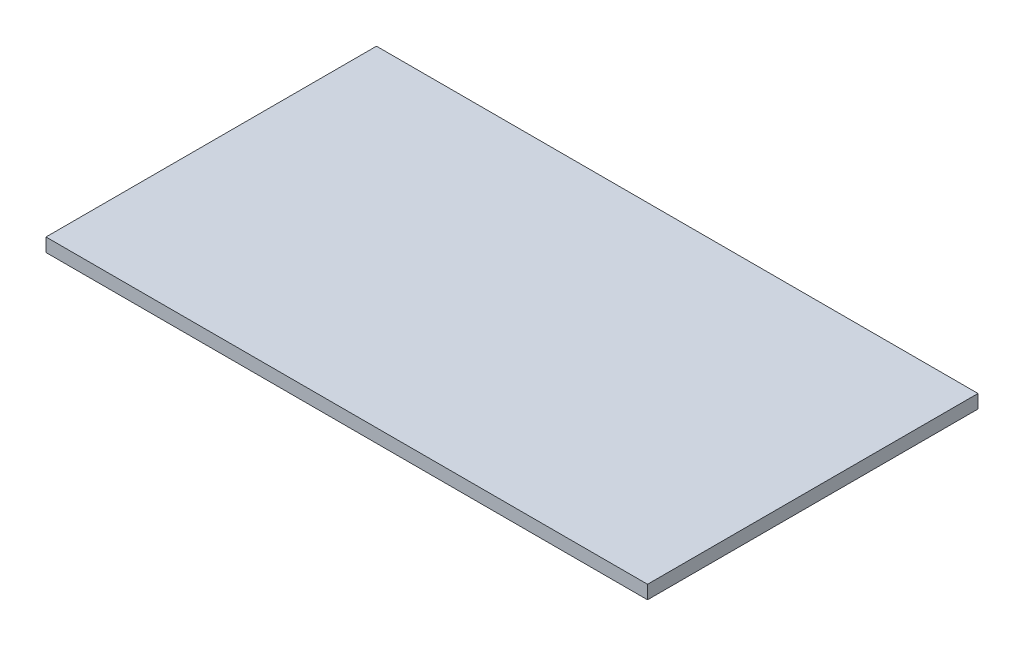
ISO-10303-21;
HEADER;
FILE_DESCRIPTION(('STEP AP214'),'2;1');
FILE_NAME('part.step','',(''),(''),'','','');
FILE_SCHEMA(('AUTOMOTIVE_DESIGN { 1 0 10303 214 1 1 1 1 }'));
ENDSEC;
DATA;
#1=APPLICATION_CONTEXT('core data for automotive mechanical design processes');
#2=APPLICATION_PROTOCOL_DEFINITION('international standard','automotive_design',2000,#1);
#3=PRODUCT_CONTEXT('',#1,'mechanical');
#4=PRODUCT('Part','Part','',(#3));
#5=PRODUCT_RELATED_PRODUCT_CATEGORY('part','',(#4));
#6=PRODUCT_DEFINITION_FORMATION('','',#4);
#7=PRODUCT_DEFINITION_CONTEXT('part definition',#1,'design');
#8=PRODUCT_DEFINITION('design','',#6,#7);
#9=PRODUCT_DEFINITION_SHAPE('','',#8);
#10=(LENGTH_UNIT() NAMED_UNIT(*) SI_UNIT(.MILLI.,.METRE.));
#11=(NAMED_UNIT(*) PLANE_ANGLE_UNIT() SI_UNIT($,.RADIAN.));
#12=(NAMED_UNIT(*) SI_UNIT($,.STERADIAN.) SOLID_ANGLE_UNIT());
#13=UNCERTAINTY_MEASURE_WITH_UNIT(LENGTH_MEASURE(1.E-05),#10,'distance_accuracy_value','');
#14=(GEOMETRIC_REPRESENTATION_CONTEXT(3) GLOBAL_UNCERTAINTY_ASSIGNED_CONTEXT((#13)) GLOBAL_UNIT_ASSIGNED_CONTEXT((#10,
#11,#12)) REPRESENTATION_CONTEXT('',''));
#15=CARTESIAN_POINT('',(0.,0.,0.));
#16=DIRECTION('',(0.,0.,1.));
#17=DIRECTION('',(1.,0.,0.));
#18=AXIS2_PLACEMENT_3D('',#15,#16,#17);
#19=CARTESIAN_POINT('',(-354.98178458526,11.43,-36.9171322926299));
#20=DIRECTION('',(1.,0.,0.));
#21=DIRECTION('',(0.,0.,-1.));
#22=AXIS2_PLACEMENT_3D('',#19,#20,#21);
#23=PLANE('',#22);
#24=DIRECTION('',(0.,0.,1.));
#25=VECTOR('',#24,1.);
#26=CARTESIAN_POINT('',(-354.98178458526,0.,-36.9171322926299));
#27=LINE('',#26,#25);
#28=CARTESIAN_POINT('',(-354.98178458526,0.,-36.9171322926299));
#29=VERTEX_POINT('',#28);
#30=CARTESIAN_POINT('',(-354.98178458526,0.,243.13056770737));
#31=VERTEX_POINT('',#30);
#32=EDGE_CURVE('E95',#29,#31,#27,.T.);
#33=ORIENTED_EDGE('',*,*,#32,.T.);
#34=DIRECTION('',(0.,-1.,0.));
#35=VECTOR('',#34,1.);
#36=CARTESIAN_POINT('',(-354.98178458526,11.43,243.13056770737));
#37=LINE('',#36,#35);
#38=CARTESIAN_POINT('',(-354.98178458526,11.43,243.13056770737));
#39=VERTEX_POINT('',#38);
#40=EDGE_CURVE('E11',#39,#31,#37,.T.);
#41=ORIENTED_EDGE('',*,*,#40,.F.);
#42=DIRECTION('',(0.,0.,1.));
#43=VECTOR('',#42,1.);
#44=CARTESIAN_POINT('',(-354.98178458526,11.43,-36.9171322926299));
#45=LINE('',#44,#43);
#46=CARTESIAN_POINT('',(-354.98178458526,11.43,-36.9171322926299));
#47=VERTEX_POINT('',#46);
#48=EDGE_CURVE('E83',#47,#39,#45,.T.);
#49=ORIENTED_EDGE('',*,*,#48,.F.);
#50=DIRECTION('',(0.,-1.,0.));
#51=VECTOR('',#50,1.);
#52=CARTESIAN_POINT('',(-354.98178458526,11.43,-36.9171322926299));
#53=LINE('',#52,#51);
#54=EDGE_CURVE('E91',#47,#29,#53,.T.);
#55=ORIENTED_EDGE('',*,*,#54,.T.);
#56=EDGE_LOOP('',(#33,#41,#49,#55));
#57=FACE_BOUND('',#56,.T.);
#58=ADVANCED_FACE('F32',(#57),#23,.F.);
#59=CARTESIAN_POINT('',(-354.98178458526,11.43,243.13056770737));
#60=DIRECTION('',(0.,0.,-1.));
#61=DIRECTION('',(-1.,0.,0.));
#62=AXIS2_PLACEMENT_3D('',#59,#60,#61);
#63=PLANE('',#62);
#64=DIRECTION('',(1.,0.,0.));
#65=VECTOR('',#64,1.);
#66=CARTESIAN_POINT('',(-354.98178458526,0.,243.13056770737));
#67=LINE('',#66,#65);
#68=CARTESIAN_POINT('',(154.76573541474,0.,243.13056770737));
#69=VERTEX_POINT('',#68);
#70=EDGE_CURVE('E87',#31,#69,#67,.T.);
#71=ORIENTED_EDGE('',*,*,#70,.T.);
#72=DIRECTION('',(0.,-1.,0.));
#73=VECTOR('',#72,1.);
#74=CARTESIAN_POINT('',(154.76573541474,11.43,243.13056770737));
#75=LINE('',#74,#73);
#76=CARTESIAN_POINT('',(154.76573541474,11.43,243.13056770737));
#77=VERTEX_POINT('',#76);
#78=EDGE_CURVE('E40',#77,#69,#75,.T.);
#79=ORIENTED_EDGE('',*,*,#78,.F.);
#80=DIRECTION('',(1.,0.,0.));
#81=VECTOR('',#80,1.);
#82=CARTESIAN_POINT('',(-354.98178458526,11.43,243.13056770737));
#83=LINE('',#82,#81);
#84=EDGE_CURVE('E78',#39,#77,#83,.T.);
#85=ORIENTED_EDGE('',*,*,#84,.F.);
#86=ORIENTED_EDGE('',*,*,#40,.T.);
#87=EDGE_LOOP('',(#71,#79,#85,#86));
#88=FACE_BOUND('',#87,.T.);
#89=ADVANCED_FACE('F86',(#88),#63,.F.);
#90=CARTESIAN_POINT('',(154.76573541474,11.43,-36.9171322926299));
#91=DIRECTION('',(-1.,0.,0.));
#92=DIRECTION('',(0.,0.,1.));
#93=AXIS2_PLACEMENT_3D('',#90,#91,#92);
#94=PLANE('',#93);
#95=DIRECTION('',(0.,0.,-1.));
#96=VECTOR('',#95,1.);
#97=CARTESIAN_POINT('',(154.76573541474,0.,-36.9171322926299));
#98=LINE('',#97,#96);
#99=CARTESIAN_POINT('',(154.76573541474,0.,-36.9171322926299));
#100=VERTEX_POINT('',#99);
#101=EDGE_CURVE('E65',#69,#100,#98,.T.);
#102=ORIENTED_EDGE('',*,*,#101,.T.);
#103=DIRECTION('',(0.,-1.,0.));
#104=VECTOR('',#103,1.);
#105=CARTESIAN_POINT('',(154.76573541474,11.43,-36.9171322926299));
#106=LINE('',#105,#104);
#107=CARTESIAN_POINT('',(154.76573541474,11.43,-36.9171322926299));
#108=VERTEX_POINT('',#107);
#109=EDGE_CURVE('E88',#108,#100,#106,.T.);
#110=ORIENTED_EDGE('',*,*,#109,.F.);
#111=DIRECTION('',(0.,0.,-1.));
#112=VECTOR('',#111,1.);
#113=CARTESIAN_POINT('',(154.76573541474,11.43,-36.9171322926299));
#114=LINE('',#113,#112);
#115=EDGE_CURVE('E81',#77,#108,#114,.T.);
#116=ORIENTED_EDGE('',*,*,#115,.F.);
#117=ORIENTED_EDGE('',*,*,#78,.T.);
#118=EDGE_LOOP('',(#102,#110,#116,#117));
#119=FACE_BOUND('',#118,.T.);
#120=ADVANCED_FACE('F89',(#119),#94,.F.);
#121=CARTESIAN_POINT('',(-354.98178458526,11.43,-36.9171322926299));
#122=DIRECTION('',(0.,0.,1.));
#123=DIRECTION('',(1.,0.,0.));
#124=AXIS2_PLACEMENT_3D('',#121,#122,#123);
#125=PLANE('',#124);
#126=DIRECTION('',(-1.,0.,0.));
#127=VECTOR('',#126,1.);
#128=CARTESIAN_POINT('',(-354.98178458526,0.,-36.9171322926299));
#129=LINE('',#128,#127);
#130=EDGE_CURVE('E71',#100,#29,#129,.T.);
#131=ORIENTED_EDGE('',*,*,#130,.T.);
#132=ORIENTED_EDGE('',*,*,#54,.F.);
#133=DIRECTION('',(-1.,0.,0.));
#134=VECTOR('',#133,1.);
#135=CARTESIAN_POINT('',(-354.98178458526,11.43,-36.9171322926299));
#136=LINE('',#135,#134);
#137=EDGE_CURVE('E48',#108,#47,#136,.T.);
#138=ORIENTED_EDGE('',*,*,#137,.F.);
#139=ORIENTED_EDGE('',*,*,#109,.T.);
#140=EDGE_LOOP('',(#131,#132,#138,#139));
#141=FACE_BOUND('',#140,.T.);
#142=ADVANCED_FACE('F102',(#141),#125,.F.);
#143=CARTESIAN_POINT('',(0.,11.43,0.));
#144=DIRECTION('',(0.,1.,0.));
#145=DIRECTION('',(0.,0.,1.));
#146=AXIS2_PLACEMENT_3D('',#143,#144,#145);
#147=PLANE('',#146);
#148=ORIENTED_EDGE('',*,*,#48,.T.);
#149=ORIENTED_EDGE('',*,*,#84,.T.);
#150=ORIENTED_EDGE('',*,*,#115,.T.);
#151=ORIENTED_EDGE('',*,*,#137,.T.);
#152=EDGE_LOOP('',(#148,#149,#150,#151));
#153=FACE_BOUND('',#152,.T.);
#154=ADVANCED_FACE('F79',(#153),#147,.T.);
#155=CARTESIAN_POINT('',(0.,0.,0.));
#156=DIRECTION('',(0.,1.,0.));
#157=DIRECTION('',(0.,0.,1.));
#158=AXIS2_PLACEMENT_3D('',#155,#156,#157);
#159=PLANE('',#158);
#160=ORIENTED_EDGE('',*,*,#32,.F.);
#161=ORIENTED_EDGE('',*,*,#130,.F.);
#162=ORIENTED_EDGE('',*,*,#101,.F.);
#163=ORIENTED_EDGE('',*,*,#70,.F.);
#164=EDGE_LOOP('',(#160,#161,#162,#163));
#165=FACE_BOUND('',#164,.T.);
#166=ADVANCED_FACE('F105',(#165),#159,.F.);
#167=CLOSED_SHELL('',(#58,#89,#120,#142,#154,#166));
#168=MANIFOLD_SOLID_BREP('B2',#167);
#169=ADVANCED_BREP_SHAPE_REPRESENTATION('',(#18,#168),#14);
#170=SHAPE_DEFINITION_REPRESENTATION(#9,#169);
ENDSEC;
END-ISO-10303-21;
